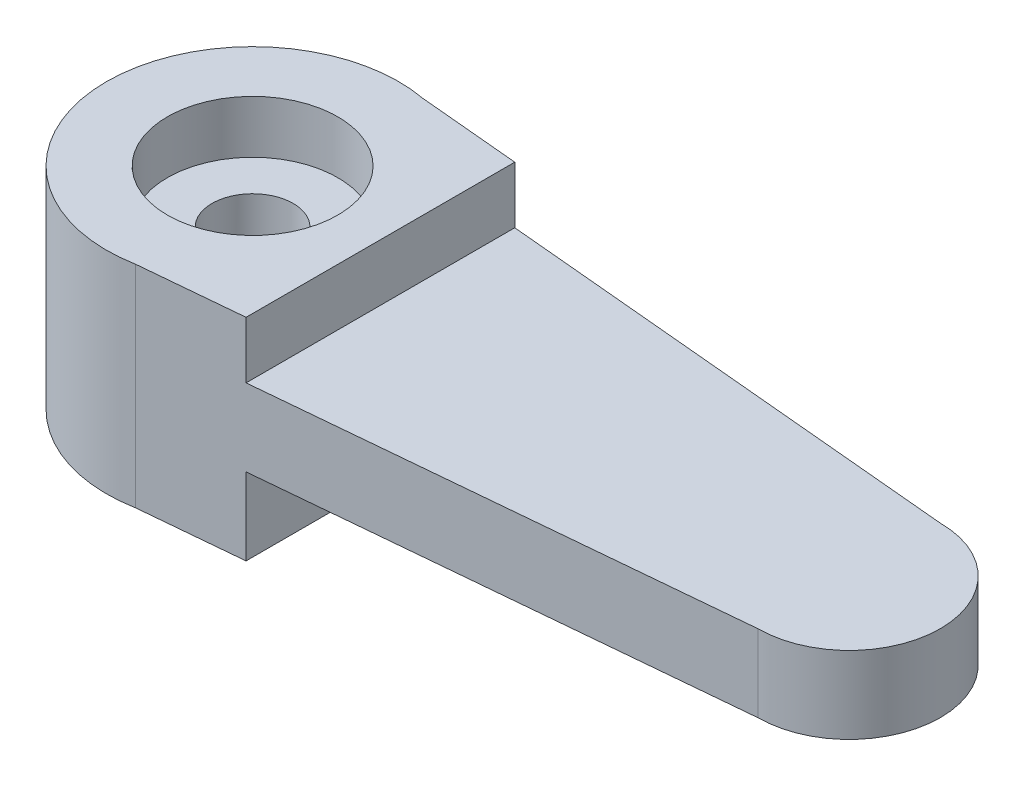
ISO-10303-21;
HEADER;
FILE_DESCRIPTION(('STEP AP214'),'2;1');
FILE_NAME('part.step','',(''),(''),'','','');
FILE_SCHEMA(('AUTOMOTIVE_DESIGN { 1 0 10303 214 1 1 1 1 }'));
ENDSEC;
DATA;
#1=APPLICATION_CONTEXT('core data for automotive mechanical design processes');
#2=APPLICATION_PROTOCOL_DEFINITION('international standard','automotive_design',2000,#1);
#3=PRODUCT_CONTEXT('',#1,'mechanical');
#4=PRODUCT('Part','Part','',(#3));
#5=PRODUCT_RELATED_PRODUCT_CATEGORY('part','',(#4));
#6=PRODUCT_DEFINITION_FORMATION('','',#4);
#7=PRODUCT_DEFINITION_CONTEXT('part definition',#1,'design');
#8=PRODUCT_DEFINITION('design','',#6,#7);
#9=PRODUCT_DEFINITION_SHAPE('','',#8);
#10=(LENGTH_UNIT() NAMED_UNIT(*) SI_UNIT(.MILLI.,.METRE.));
#11=(NAMED_UNIT(*) PLANE_ANGLE_UNIT() SI_UNIT($,.RADIAN.));
#12=(NAMED_UNIT(*) SI_UNIT($,.STERADIAN.) SOLID_ANGLE_UNIT());
#13=UNCERTAINTY_MEASURE_WITH_UNIT(LENGTH_MEASURE(1.E-05),#10,'distance_accuracy_value','');
#14=(GEOMETRIC_REPRESENTATION_CONTEXT(3) GLOBAL_UNCERTAINTY_ASSIGNED_CONTEXT((#13)) GLOBAL_UNIT_ASSIGNED_CONTEXT((#10,
#11,#12)) REPRESENTATION_CONTEXT('',''));
#15=CARTESIAN_POINT('',(0.,0.,0.));
#16=DIRECTION('',(0.,0.,1.));
#17=DIRECTION('',(1.,0.,0.));
#18=AXIS2_PLACEMENT_3D('',#15,#16,#17);
#19=CARTESIAN_POINT('',(0.,-3.69999999999998,0.));
#20=DIRECTION('',(0.,1.,0.));
#21=DIRECTION('',(0.,0.,1.));
#22=AXIS2_PLACEMENT_3D('',#19,#20,#21);
#23=CYLINDRICAL_SURFACE('',#22,1.);
#24=CARTESIAN_POINT('',(0.,1.30000000000002,0.));
#25=DIRECTION('',(0.,1.,0.));
#26=DIRECTION('',(0.,0.,1.));
#27=AXIS2_PLACEMENT_3D('',#24,#25,#26);
#28=CIRCLE('',#27,1.);
#29=CARTESIAN_POINT('',(0.,1.30000000000003,0.999999999999982));
#30=VERTEX_POINT('',#29);
#31=EDGE_CURVE('E155',#30,#30,#28,.T.);
#32=ORIENTED_EDGE('',*,*,#31,.T.);
#33=EDGE_LOOP('',(#32));
#34=FACE_BOUND('',#33,.T.);
#35=CARTESIAN_POINT('',(0.,0.200000000000004,0.));
#36=DIRECTION('',(0.,-1.,0.));
#37=DIRECTION('',(0.,0.,-1.));
#38=AXIS2_PLACEMENT_3D('',#35,#36,#37);
#39=CIRCLE('',#38,1.);
#40=CARTESIAN_POINT('',(0.,0.199999999999997,-1.));
#41=VERTEX_POINT('',#40);
#42=EDGE_CURVE('E152',#41,#41,#39,.F.);
#43=ORIENTED_EDGE('',*,*,#42,.F.);
#44=EDGE_LOOP('',(#43));
#45=FACE_BOUND('',#44,.T.);
#46=ADVANCED_FACE('F50',(#34,#45),#23,.F.);
#47=CARTESIAN_POINT('',(14.7,2.6,0.));
#48=DIRECTION('',(0.,-1.,0.));
#49=DIRECTION('',(0.,0.,-1.));
#50=AXIS2_PLACEMENT_3D('',#47,#48,#49);
#51=CYLINDRICAL_SURFACE('',#50,2.25);
#52=CARTESIAN_POINT('',(14.7,1.19988894869433,0.));
#53=DIRECTION('',(0.,-1.,0.));
#54=DIRECTION('',(0.,0.,-1.));
#55=AXIS2_PLACEMENT_3D('',#52,#53,#54);
#56=CIRCLE('',#55,2.25);
#57=CARTESIAN_POINT('',(14.7,1.19988894869433,-2.25));
#58=VERTEX_POINT('',#57);
#59=CARTESIAN_POINT('',(14.7,1.19988894869433,2.25));
#60=VERTEX_POINT('',#59);
#61=EDGE_CURVE('E121',#58,#60,#56,.T.);
#62=ORIENTED_EDGE('',*,*,#61,.T.);
#63=DIRECTION('',(0.,-1.,0.));
#64=VECTOR('',#63,1.);
#65=CARTESIAN_POINT('',(14.7,2.6,2.25));
#66=LINE('',#65,#64);
#67=CARTESIAN_POINT('',(14.7,-0.7,2.25));
#68=VERTEX_POINT('',#67);
#69=EDGE_CURVE('E182',#60,#68,#66,.T.);
#70=ORIENTED_EDGE('',*,*,#69,.T.);
#71=CARTESIAN_POINT('',(14.7,-0.700000000000001,0.));
#72=DIRECTION('',(0.,1.,0.));
#73=DIRECTION('',(-1.,0.,0.));
#74=AXIS2_PLACEMENT_3D('',#71,#72,#73);
#75=CIRCLE('',#74,2.25);
#76=CARTESIAN_POINT('',(14.7,-0.700000000000001,-2.25));
#77=VERTEX_POINT('',#76);
#78=EDGE_CURVE('E142',#68,#77,#75,.T.);
#79=ORIENTED_EDGE('',*,*,#78,.T.);
#80=DIRECTION('',(0.,-1.,0.));
#81=VECTOR('',#80,1.);
#82=CARTESIAN_POINT('',(14.7,2.6,-2.25));
#83=LINE('',#82,#81);
#84=EDGE_CURVE('E180',#58,#77,#83,.T.);
#85=ORIENTED_EDGE('',*,*,#84,.F.);
#86=EDGE_LOOP('',(#62,#70,#79,#85));
#87=FACE_BOUND('',#86,.T.);
#88=ADVANCED_FACE('F216',(#87),#51,.T.);
#89=CARTESIAN_POINT('',(0.327847186370676,2.6,-3.56989158492514));
#90=DIRECTION('',(0.091451892445728,0.,-0.99580949552015));
#91=DIRECTION('',(-0.99580949552015,0.,-0.091451892445728));
#92=AXIS2_PLACEMENT_3D('',#89,#90,#91);
#93=PLANE('',#92);
#94=DIRECTION('',(0.,1.,0.));
#95=VECTOR('',#94,1.);
#96=CARTESIAN_POINT('',(3.15,2.6,-3.31071428571429));
#97=LINE('',#96,#95);
#98=CARTESIAN_POINT('',(3.15,1.19988894869433,-3.31071428571429));
#99=VERTEX_POINT('',#98);
#100=CARTESIAN_POINT('',(3.15,2.6,-3.31071428571429));
#101=VERTEX_POINT('',#100);
#102=EDGE_CURVE('E65',#99,#101,#97,.T.);
#103=ORIENTED_EDGE('',*,*,#102,.F.);
#104=DIRECTION('',(-0.99580949552015,0.,-0.091451892445728));
#105=VECTOR('',#104,1.);
#106=CARTESIAN_POINT('',(0.327847186370676,1.19988894869433,-3.56989158492514));
#107=LINE('',#106,#105);
#108=EDGE_CURVE('E117',#58,#99,#107,.T.);
#109=ORIENTED_EDGE('',*,*,#108,.F.);
#110=ORIENTED_EDGE('',*,*,#84,.T.);
#111=DIRECTION('',(0.99580949552015,0.,0.091451892445728));
#112=VECTOR('',#111,1.);
#113=CARTESIAN_POINT('',(0.327847186370677,-0.700000000000002,-3.56989158492514));
#114=LINE('',#113,#112);
#115=CARTESIAN_POINT('',(3.15,-0.700000000000002,-3.31071428571429));
#116=VERTEX_POINT('',#115);
#117=EDGE_CURVE('E145',#116,#77,#114,.T.);
#118=ORIENTED_EDGE('',*,*,#117,.F.);
#119=DIRECTION('',(0.,1.,0.));
#120=VECTOR('',#119,1.);
#121=CARTESIAN_POINT('',(3.15,2.6,-3.31071428571429));
#122=LINE('',#121,#120);
#123=CARTESIAN_POINT('',(3.15,-2.6,-3.31071428571429));
#124=VERTEX_POINT('',#123);
#125=EDGE_CURVE('E140',#124,#116,#122,.T.);
#126=ORIENTED_EDGE('',*,*,#125,.F.);
#127=DIRECTION('',(0.99580949552015,0.,0.091451892445728));
#128=VECTOR('',#127,1.);
#129=CARTESIAN_POINT('',(0.327847186370676,-2.6,-3.56989158492514));
#130=LINE('',#129,#128);
#131=CARTESIAN_POINT('',(0.655694372741351,-2.6,-3.53978316985028));
#132=VERTEX_POINT('',#131);
#133=EDGE_CURVE('E168',#132,#124,#130,.T.);
#134=ORIENTED_EDGE('',*,*,#133,.F.);
#135=DIRECTION('',(0.,-1.,0.));
#136=VECTOR('',#135,1.);
#137=CARTESIAN_POINT('',(0.655694372741351,2.6,-3.53978316985028));
#138=LINE('',#137,#136);
#139=CARTESIAN_POINT('',(0.655694372741351,2.6,-3.53978316985028));
#140=VERTEX_POINT('',#139);
#141=EDGE_CURVE('E178',#140,#132,#138,.T.);
#142=ORIENTED_EDGE('',*,*,#141,.F.);
#143=DIRECTION('',(0.99580949552015,0.,0.091451892445728));
#144=VECTOR('',#143,1.);
#145=CARTESIAN_POINT('',(0.327847186370676,2.6,-3.56989158492514));
#146=LINE('',#145,#144);
#147=EDGE_CURVE('E133',#140,#101,#146,.T.);
#148=ORIENTED_EDGE('',*,*,#147,.T.);
#149=EDGE_LOOP('',(#103,#109,#110,#118,#126,#134,#142,#148));
#150=FACE_BOUND('',#149,.T.);
#151=ADVANCED_FACE('F131',(#150),#93,.T.);
#152=CARTESIAN_POINT('',(0.327847186370676,2.6,3.56989158492514));
#153=DIRECTION('',(-0.091451892445728,0.,-0.99580949552015));
#154=DIRECTION('',(-0.99580949552015,0.,0.091451892445728));
#155=AXIS2_PLACEMENT_3D('',#152,#153,#154);
#156=PLANE('',#155);
#157=DIRECTION('',(-0.99580949552015,0.,0.091451892445728));
#158=VECTOR('',#157,1.);
#159=CARTESIAN_POINT('',(0.327847186370676,1.19988894869433,3.56989158492514));
#160=LINE('',#159,#158);
#161=CARTESIAN_POINT('',(3.15,1.19988894869433,3.31071428571429));
#162=VERTEX_POINT('',#161);
#163=EDGE_CURVE('E12',#60,#162,#160,.T.);
#164=ORIENTED_EDGE('',*,*,#163,.T.);
#165=DIRECTION('',(0.,1.,0.));
#166=VECTOR('',#165,1.);
#167=CARTESIAN_POINT('',(3.15,2.6,3.31071428571429));
#168=LINE('',#167,#166);
#169=CARTESIAN_POINT('',(3.15,2.6,3.31071428571429));
#170=VERTEX_POINT('',#169);
#171=EDGE_CURVE('E128',#162,#170,#168,.T.);
#172=ORIENTED_EDGE('',*,*,#171,.T.);
#173=DIRECTION('',(0.99580949552015,0.,-0.091451892445728));
#174=VECTOR('',#173,1.);
#175=CARTESIAN_POINT('',(0.327847186370676,2.6,3.56989158492514));
#176=LINE('',#175,#174);
#177=CARTESIAN_POINT('',(0.655694372741351,2.6,3.53978316985028));
#178=VERTEX_POINT('',#177);
#179=EDGE_CURVE('E165',#178,#170,#176,.T.);
#180=ORIENTED_EDGE('',*,*,#179,.F.);
#181=DIRECTION('',(0.,-1.,0.));
#182=VECTOR('',#181,1.);
#183=CARTESIAN_POINT('',(0.655694372741351,2.6,3.53978316985028));
#184=LINE('',#183,#182);
#185=CARTESIAN_POINT('',(0.655694372741351,-2.6,3.53978316985028));
#186=VERTEX_POINT('',#185);
#187=EDGE_CURVE('E170',#178,#186,#184,.T.);
#188=ORIENTED_EDGE('',*,*,#187,.T.);
#189=DIRECTION('',(0.99580949552015,0.,-0.091451892445728));
#190=VECTOR('',#189,1.);
#191=CARTESIAN_POINT('',(0.327847186370676,-2.6,3.56989158492514));
#192=LINE('',#191,#190);
#193=CARTESIAN_POINT('',(3.15,-2.6,3.31071428571429));
#194=VERTEX_POINT('',#193);
#195=EDGE_CURVE('E171',#186,#194,#192,.T.);
#196=ORIENTED_EDGE('',*,*,#195,.T.);
#197=DIRECTION('',(0.,1.,0.));
#198=VECTOR('',#197,1.);
#199=CARTESIAN_POINT('',(3.15,2.6,3.31071428571429));
#200=LINE('',#199,#198);
#201=CARTESIAN_POINT('',(3.15,-0.700000000000002,3.31071428571429));
#202=VERTEX_POINT('',#201);
#203=EDGE_CURVE('E73',#194,#202,#200,.T.);
#204=ORIENTED_EDGE('',*,*,#203,.T.);
#205=DIRECTION('',(0.99580949552015,0.,-0.091451892445728));
#206=VECTOR('',#205,1.);
#207=CARTESIAN_POINT('',(0.327847186370677,-0.700000000000002,3.56989158492514));
#208=LINE('',#207,#206);
#209=EDGE_CURVE('E192',#202,#68,#208,.T.);
#210=ORIENTED_EDGE('',*,*,#209,.T.);
#211=ORIENTED_EDGE('',*,*,#69,.F.);
#212=EDGE_LOOP('',(#164,#172,#180,#188,#196,#204,#210,#211));
#213=FACE_BOUND('',#212,.T.);
#214=ADVANCED_FACE('F197',(#213),#156,.F.);
#215=CARTESIAN_POINT('',(0.,-2.6,0.));
#216=DIRECTION('',(0.,1.,0.));
#217=DIRECTION('',(0.,0.,1.));
#218=AXIS2_PLACEMENT_3D('',#215,#216,#217);
#219=PLANE('',#218);
#220=CARTESIAN_POINT('',(0.,-2.6,0.));
#221=DIRECTION('',(0.,-1.,0.));
#222=DIRECTION('',(0.,0.,-1.));
#223=AXIS2_PLACEMENT_3D('',#220,#221,#222);
#224=CIRCLE('',#223,2.1);
#225=CARTESIAN_POINT('',(0.,-2.60000000000001,-2.09999999999996));
#226=VERTEX_POINT('',#225);
#227=EDGE_CURVE('E148',#226,#226,#224,.T.);
#228=ORIENTED_EDGE('',*,*,#227,.F.);
#229=EDGE_LOOP('',(#228));
#230=FACE_BOUND('',#229,.T.);
#231=ORIENTED_EDGE('',*,*,#133,.T.);
#232=DIRECTION('',(0.,0.,1.));
#233=VECTOR('',#232,1.);
#234=CARTESIAN_POINT('',(3.15,-2.6,0.));
#235=LINE('',#234,#233);
#236=EDGE_CURVE('E184',#124,#194,#235,.T.);
#237=ORIENTED_EDGE('',*,*,#236,.T.);
#238=ORIENTED_EDGE('',*,*,#195,.F.);
#239=CARTESIAN_POINT('',(0.,-2.6,0.));
#240=DIRECTION('',(0.,1.,0.));
#241=DIRECTION('',(0.,0.,1.));
#242=AXIS2_PLACEMENT_3D('',#239,#240,#241);
#243=CIRCLE('',#242,3.6);
#244=EDGE_CURVE('E162',#132,#186,#243,.T.);
#245=ORIENTED_EDGE('',*,*,#244,.F.);
#246=EDGE_LOOP('',(#231,#237,#238,#245));
#247=FACE_BOUND('',#246,.T.);
#248=ADVANCED_FACE('F206',(#230,#247),#219,.F.);
#249=CARTESIAN_POINT('',(0.,2.6,0.));
#250=DIRECTION('',(0.,1.,0.));
#251=DIRECTION('',(0.,0.,1.));
#252=AXIS2_PLACEMENT_3D('',#249,#250,#251);
#253=PLANE('',#252);
#254=DIRECTION('',(0.,0.,1.));
#255=VECTOR('',#254,1.);
#256=CARTESIAN_POINT('',(3.15,2.6,0.));
#257=LINE('',#256,#255);
#258=EDGE_CURVE('E58',#101,#170,#257,.T.);
#259=ORIENTED_EDGE('',*,*,#258,.F.);
#260=ORIENTED_EDGE('',*,*,#147,.F.);
#261=CARTESIAN_POINT('',(0.,2.6,0.));
#262=DIRECTION('',(0.,1.,0.));
#263=DIRECTION('',(0.,0.,1.));
#264=AXIS2_PLACEMENT_3D('',#261,#262,#263);
#265=CIRCLE('',#264,3.6);
#266=EDGE_CURVE('E174',#140,#178,#265,.T.);
#267=ORIENTED_EDGE('',*,*,#266,.T.);
#268=ORIENTED_EDGE('',*,*,#179,.T.);
#269=EDGE_LOOP('',(#259,#260,#267,#268));
#270=FACE_BOUND('',#269,.T.);
#271=CARTESIAN_POINT('',(0.,2.60000000000001,0.));
#272=DIRECTION('',(0.,1.,0.));
#273=DIRECTION('',(0.,0.,1.));
#274=AXIS2_PLACEMENT_3D('',#271,#272,#273);
#275=CIRCLE('',#274,2.1);
#276=CARTESIAN_POINT('',(0.,2.60000000000003,2.09999999999998));
#277=VERTEX_POINT('',#276);
#278=EDGE_CURVE('E158',#277,#277,#275,.T.);
#279=ORIENTED_EDGE('',*,*,#278,.F.);
#280=EDGE_LOOP('',(#279));
#281=FACE_BOUND('',#280,.T.);
#282=ADVANCED_FACE('F199',(#270,#281),#253,.T.);
#283=CARTESIAN_POINT('',(0.,2.6,0.));
#284=DIRECTION('',(0.,-1.,0.));
#285=DIRECTION('',(0.,0.,-1.));
#286=AXIS2_PLACEMENT_3D('',#283,#284,#285);
#287=CYLINDRICAL_SURFACE('',#286,3.6);
#288=ORIENTED_EDGE('',*,*,#244,.T.);
#289=ORIENTED_EDGE('',*,*,#187,.F.);
#290=ORIENTED_EDGE('',*,*,#266,.F.);
#291=ORIENTED_EDGE('',*,*,#141,.T.);
#292=EDGE_LOOP('',(#288,#289,#290,#291));
#293=FACE_BOUND('',#292,.T.);
#294=ADVANCED_FACE('F52',(#293),#287,.T.);
#295=CARTESIAN_POINT('',(0.,1.30000000000001,0.));
#296=DIRECTION('',(0.,1.,0.));
#297=DIRECTION('',(0.,0.,1.));
#298=AXIS2_PLACEMENT_3D('',#295,#296,#297);
#299=CYLINDRICAL_SURFACE('',#298,2.1);
#300=CARTESIAN_POINT('',(0.,1.30000000000001,0.));
#301=DIRECTION('',(0.,1.,0.));
#302=DIRECTION('',(0.,0.,1.));
#303=AXIS2_PLACEMENT_3D('',#300,#301,#302);
#304=CIRCLE('',#303,2.1);
#305=CARTESIAN_POINT('',(0.,1.30000000000003,2.09999999999999));
#306=VERTEX_POINT('',#305);
#307=EDGE_CURVE('E159',#306,#306,#304,.T.);
#308=ORIENTED_EDGE('',*,*,#307,.F.);
#309=EDGE_LOOP('',(#308));
#310=FACE_BOUND('',#309,.T.);
#311=ORIENTED_EDGE('',*,*,#278,.T.);
#312=EDGE_LOOP('',(#311));
#313=FACE_BOUND('',#312,.T.);
#314=ADVANCED_FACE('F238',(#310,#313),#299,.F.);
#315=CARTESIAN_POINT('',(0.,1.30000000000001,0.));
#316=DIRECTION('',(0.,1.,0.));
#317=DIRECTION('',(0.,0.,1.));
#318=AXIS2_PLACEMENT_3D('',#315,#316,#317);
#319=PLANE('',#318);
#320=ORIENTED_EDGE('',*,*,#31,.F.);
#321=EDGE_LOOP('',(#320));
#322=FACE_BOUND('',#321,.T.);
#323=ORIENTED_EDGE('',*,*,#307,.T.);
#324=EDGE_LOOP('',(#323));
#325=FACE_BOUND('',#324,.T.);
#326=ADVANCED_FACE('F241',(#322,#325),#319,.T.);
#327=CARTESIAN_POINT('',(0.,0.200000000000004,0.));
#328=DIRECTION('',(0.,-1.,0.));
#329=DIRECTION('',(0.,0.,-1.));
#330=AXIS2_PLACEMENT_3D('',#327,#328,#329);
#331=PLANE('',#330);
#332=CARTESIAN_POINT('',(0.,0.200000000000004,0.));
#333=DIRECTION('',(0.,-1.,0.));
#334=DIRECTION('',(0.,0.,-1.));
#335=AXIS2_PLACEMENT_3D('',#332,#333,#334);
#336=CIRCLE('',#335,2.1);
#337=CARTESIAN_POINT('',(0.,0.199999999999989,-2.09999999999998));
#338=VERTEX_POINT('',#337);
#339=EDGE_CURVE('E149',#338,#338,#336,.T.);
#340=ORIENTED_EDGE('',*,*,#339,.T.);
#341=EDGE_LOOP('',(#340));
#342=FACE_BOUND('',#341,.T.);
#343=ORIENTED_EDGE('',*,*,#42,.T.);
#344=EDGE_LOOP('',(#343));
#345=FACE_BOUND('',#344,.T.);
#346=ADVANCED_FACE('F244',(#342,#345),#331,.T.);
#347=CARTESIAN_POINT('',(0.,0.200000000000004,0.));
#348=DIRECTION('',(0.,-1.,0.));
#349=DIRECTION('',(0.,0.,-1.));
#350=AXIS2_PLACEMENT_3D('',#347,#348,#349);
#351=CYLINDRICAL_SURFACE('',#350,2.1);
#352=ORIENTED_EDGE('',*,*,#339,.F.);
#353=EDGE_LOOP('',(#352));
#354=FACE_BOUND('',#353,.T.);
#355=ORIENTED_EDGE('',*,*,#227,.T.);
#356=EDGE_LOOP('',(#355));
#357=FACE_BOUND('',#356,.T.);
#358=ADVANCED_FACE('F247',(#354,#357),#351,.F.);
#359=CARTESIAN_POINT('',(16.95,-0.7,-5.));
#360=DIRECTION('',(0.,1.,0.));
#361=DIRECTION('',(-1.,0.,0.));
#362=AXIS2_PLACEMENT_3D('',#359,#360,#361);
#363=PLANE('',#362);
#364=ORIENTED_EDGE('',*,*,#117,.T.);
#365=ORIENTED_EDGE('',*,*,#78,.F.);
#366=ORIENTED_EDGE('',*,*,#209,.F.);
#367=DIRECTION('',(0.,0.,1.));
#368=VECTOR('',#367,1.);
#369=CARTESIAN_POINT('',(3.15,-0.700000000000002,-5.));
#370=LINE('',#369,#368);
#371=EDGE_CURVE('E124',#116,#202,#370,.T.);
#372=ORIENTED_EDGE('',*,*,#371,.F.);
#373=EDGE_LOOP('',(#364,#365,#366,#372));
#374=FACE_BOUND('',#373,.T.);
#375=ADVANCED_FACE('F214',(#374),#363,.F.);
#376=CARTESIAN_POINT('',(3.15,-2.6,-5.));
#377=DIRECTION('',(-1.,0.,0.));
#378=DIRECTION('',(0.,-1.,0.));
#379=AXIS2_PLACEMENT_3D('',#376,#377,#378);
#380=PLANE('',#379);
#381=ORIENTED_EDGE('',*,*,#125,.T.);
#382=ORIENTED_EDGE('',*,*,#371,.T.);
#383=ORIENTED_EDGE('',*,*,#203,.F.);
#384=ORIENTED_EDGE('',*,*,#236,.F.);
#385=EDGE_LOOP('',(#381,#382,#383,#384));
#386=FACE_BOUND('',#385,.T.);
#387=ADVANCED_FACE('F209',(#386),#380,.F.);
#388=CARTESIAN_POINT('',(3.15,1.19988894869433,-5.));
#389=DIRECTION('',(0.,-1.,0.));
#390=DIRECTION('',(0.,0.,-1.));
#391=AXIS2_PLACEMENT_3D('',#388,#389,#390);
#392=PLANE('',#391);
#393=ORIENTED_EDGE('',*,*,#108,.T.);
#394=DIRECTION('',(0.,0.,1.));
#395=VECTOR('',#394,1.);
#396=CARTESIAN_POINT('',(3.15,1.19988894869433,-5.));
#397=LINE('',#396,#395);
#398=EDGE_CURVE('E120',#99,#162,#397,.T.);
#399=ORIENTED_EDGE('',*,*,#398,.T.);
#400=ORIENTED_EDGE('',*,*,#163,.F.);
#401=ORIENTED_EDGE('',*,*,#61,.F.);
#402=EDGE_LOOP('',(#393,#399,#400,#401));
#403=FACE_BOUND('',#402,.T.);
#404=ADVANCED_FACE('F118',(#403),#392,.F.);
#405=CARTESIAN_POINT('',(3.15,1.19988894869433,-5.));
#406=DIRECTION('',(-1.,0.,0.));
#407=DIRECTION('',(0.,0.,1.));
#408=AXIS2_PLACEMENT_3D('',#405,#406,#407);
#409=PLANE('',#408);
#410=ORIENTED_EDGE('',*,*,#102,.T.);
#411=ORIENTED_EDGE('',*,*,#258,.T.);
#412=ORIENTED_EDGE('',*,*,#171,.F.);
#413=ORIENTED_EDGE('',*,*,#398,.F.);
#414=EDGE_LOOP('',(#410,#411,#412,#413));
#415=FACE_BOUND('',#414,.T.);
#416=ADVANCED_FACE('F126',(#415),#409,.F.);
#417=CLOSED_SHELL('',(#46,#88,#151,#214,#248,#282,#294,#314,#326,#346,#358,#375,#387,#404,#416));
#418=MANIFOLD_SOLID_BREP('B2',#417);
#419=ADVANCED_BREP_SHAPE_REPRESENTATION('',(#18,#418),#14);
#420=SHAPE_DEFINITION_REPRESENTATION(#9,#419);
ENDSEC;
END-ISO-10303-21;
